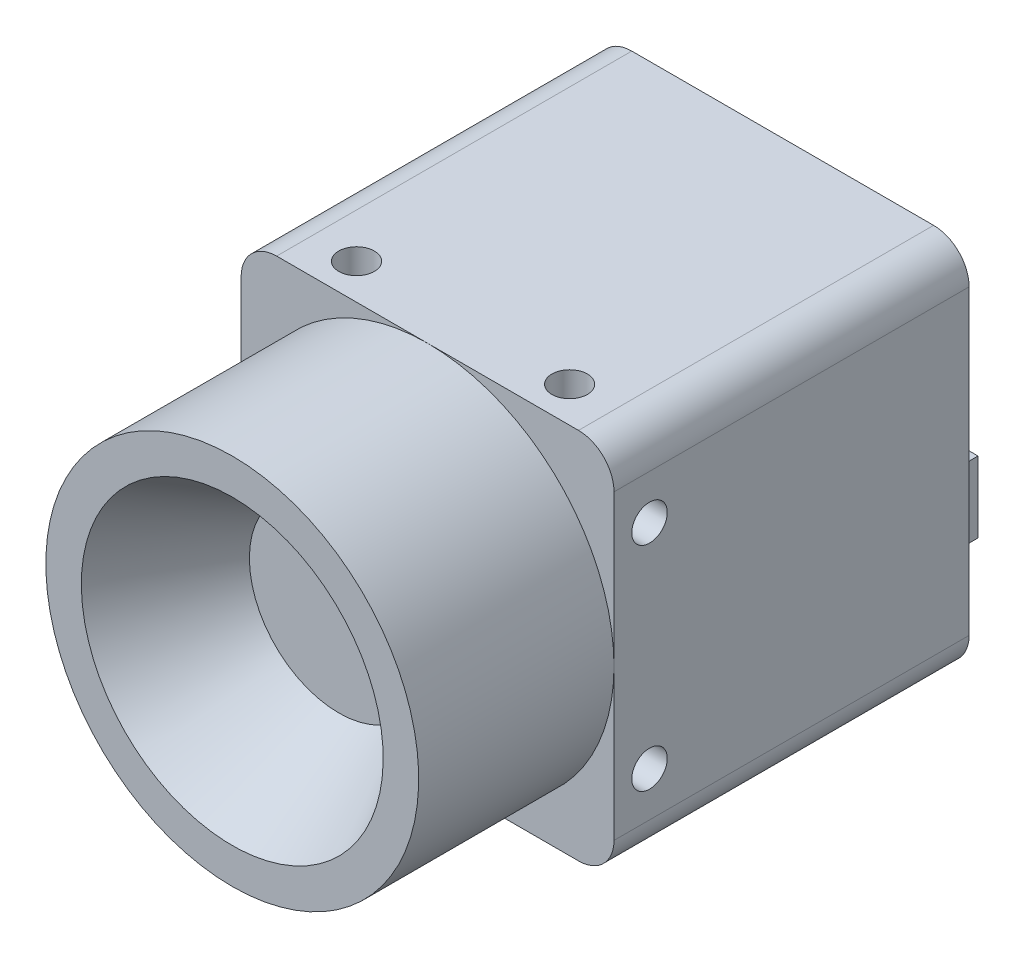
ISO-10303-21;
HEADER;
FILE_DESCRIPTION(('STEP AP214'),'2;1');
FILE_NAME('part.step','',(''),(''),'','','');
FILE_SCHEMA(('AUTOMOTIVE_DESIGN { 1 0 10303 214 1 1 1 1 }'));
ENDSEC;
DATA;
#1=APPLICATION_CONTEXT('core data for automotive mechanical design processes');
#2=APPLICATION_PROTOCOL_DEFINITION('international standard','automotive_design',2000,#1);
#3=PRODUCT_CONTEXT('',#1,'mechanical');
#4=PRODUCT('Part','Part','',(#3));
#5=PRODUCT_RELATED_PRODUCT_CATEGORY('part','',(#4));
#6=PRODUCT_DEFINITION_FORMATION('','',#4);
#7=PRODUCT_DEFINITION_CONTEXT('part definition',#1,'design');
#8=PRODUCT_DEFINITION('design','',#6,#7);
#9=PRODUCT_DEFINITION_SHAPE('','',#8);
#10=(LENGTH_UNIT() NAMED_UNIT(*) SI_UNIT(.MILLI.,.METRE.));
#11=(NAMED_UNIT(*) PLANE_ANGLE_UNIT() SI_UNIT($,.RADIAN.));
#12=(NAMED_UNIT(*) SI_UNIT($,.STERADIAN.) SOLID_ANGLE_UNIT());
#13=UNCERTAINTY_MEASURE_WITH_UNIT(LENGTH_MEASURE(1.E-05),#10,'distance_accuracy_value','');
#14=(GEOMETRIC_REPRESENTATION_CONTEXT(3) GLOBAL_UNCERTAINTY_ASSIGNED_CONTEXT((#13)) GLOBAL_UNIT_ASSIGNED_CONTEXT((#10,
#11,#12)) REPRESENTATION_CONTEXT('',''));
#15=CARTESIAN_POINT('',(0.,0.,0.));
#16=DIRECTION('',(0.,0.,1.));
#17=DIRECTION('',(1.,0.,0.));
#18=AXIS2_PLACEMENT_3D('',#15,#16,#17);
#19=CARTESIAN_POINT('',(-8.5,-8.5,0.));
#20=DIRECTION('',(0.,0.,-1.));
#21=DIRECTION('',(-1.,0.,0.));
#22=AXIS2_PLACEMENT_3D('',#19,#20,#21);
#23=PLANE('',#22);
#24=CARTESIAN_POINT('',(-8.5,-8.5,0.));
#25=DIRECTION('',(0.,0.,1.));
#26=DIRECTION('',(-1.,0.,0.));
#27=AXIS2_PLACEMENT_3D('',#24,#25,#26);
#28=CIRCLE('',#27,2.);
#29=CARTESIAN_POINT('',(-10.5,-8.49999999999999,0.));
#30=VERTEX_POINT('',#29);
#31=CARTESIAN_POINT('',(-8.49999999999999,-10.5,0.));
#32=VERTEX_POINT('',#31);
#33=EDGE_CURVE('E188',#30,#32,#28,.T.);
#34=ORIENTED_EDGE('',*,*,#33,.F.);
#35=DIRECTION('',(0.,-1.,0.));
#36=VECTOR('',#35,1.);
#37=CARTESIAN_POINT('',(-10.5,-8.49999999999999,0.));
#38=LINE('',#37,#36);
#39=CARTESIAN_POINT('',(-10.5,8.49999999999999,0.));
#40=VERTEX_POINT('',#39);
#41=EDGE_CURVE('E195',#40,#30,#38,.T.);
#42=ORIENTED_EDGE('',*,*,#41,.F.);
#43=CARTESIAN_POINT('',(-8.5,8.5,0.));
#44=DIRECTION('',(0.,0.,1.));
#45=DIRECTION('',(-1.,0.,0.));
#46=AXIS2_PLACEMENT_3D('',#43,#44,#45);
#47=CIRCLE('',#46,2.);
#48=CARTESIAN_POINT('',(-8.49999999999999,10.5,0.));
#49=VERTEX_POINT('',#48);
#50=EDGE_CURVE('E243',#49,#40,#47,.T.);
#51=ORIENTED_EDGE('',*,*,#50,.F.);
#52=DIRECTION('',(-1.,0.,0.));
#53=VECTOR('',#52,1.);
#54=CARTESIAN_POINT('',(-8.49999999999999,10.5,0.));
#55=LINE('',#54,#53);
#56=CARTESIAN_POINT('',(8.49999999999999,10.5,0.));
#57=VERTEX_POINT('',#56);
#58=EDGE_CURVE('E240',#57,#49,#55,.T.);
#59=ORIENTED_EDGE('',*,*,#58,.F.);
#60=CARTESIAN_POINT('',(8.5,8.5,0.));
#61=DIRECTION('',(0.,0.,1.));
#62=DIRECTION('',(-1.,0.,0.));
#63=AXIS2_PLACEMENT_3D('',#60,#61,#62);
#64=CIRCLE('',#63,2.);
#65=CARTESIAN_POINT('',(10.5,8.49999999999999,0.));
#66=VERTEX_POINT('',#65);
#67=EDGE_CURVE('E237',#66,#57,#64,.T.);
#68=ORIENTED_EDGE('',*,*,#67,.F.);
#69=DIRECTION('',(0.,1.,0.));
#70=VECTOR('',#69,1.);
#71=CARTESIAN_POINT('',(10.5,-8.49999999999999,0.));
#72=LINE('',#71,#70);
#73=CARTESIAN_POINT('',(10.5,-8.5,0.));
#74=VERTEX_POINT('',#73);
#75=EDGE_CURVE('E234',#74,#66,#72,.T.);
#76=ORIENTED_EDGE('',*,*,#75,.F.);
#77=CARTESIAN_POINT('',(8.5,-8.5,0.));
#78=DIRECTION('',(0.,0.,1.));
#79=DIRECTION('',(1.,0.,0.));
#80=AXIS2_PLACEMENT_3D('',#77,#78,#79);
#81=CIRCLE('',#80,2.);
#82=CARTESIAN_POINT('',(8.49999999999999,-10.5,0.));
#83=VERTEX_POINT('',#82);
#84=EDGE_CURVE('E231',#83,#74,#81,.T.);
#85=ORIENTED_EDGE('',*,*,#84,.F.);
#86=DIRECTION('',(1.,0.,0.));
#87=VECTOR('',#86,1.);
#88=CARTESIAN_POINT('',(-8.49999999999999,-10.5,0.));
#89=LINE('',#88,#87);
#90=EDGE_CURVE('E228',#32,#83,#89,.T.);
#91=ORIENTED_EDGE('',*,*,#90,.F.);
#92=EDGE_LOOP('',(#34,#42,#51,#59,#68,#76,#85,#91));
#93=FACE_BOUND('',#92,.T.);
#94=DIRECTION('',(-1.,0.,0.));
#95=VECTOR('',#94,1.);
#96=CARTESIAN_POINT('',(5.,-9.5,0.));
#97=LINE('',#96,#95);
#98=CARTESIAN_POINT('',(5.,-9.5,0.));
#99=VERTEX_POINT('',#98);
#100=CARTESIAN_POINT('',(-5.,-9.5,0.));
#101=VERTEX_POINT('',#100);
#102=EDGE_CURVE('E532',#99,#101,#97,.T.);
#103=ORIENTED_EDGE('',*,*,#102,.F.);
#104=DIRECTION('',(0.,-1.,0.));
#105=VECTOR('',#104,1.);
#106=CARTESIAN_POINT('',(5.,-5.5,0.));
#107=LINE('',#106,#105);
#108=CARTESIAN_POINT('',(5.,-5.5,0.));
#109=VERTEX_POINT('',#108);
#110=EDGE_CURVE('E167',#109,#99,#107,.T.);
#111=ORIENTED_EDGE('',*,*,#110,.F.);
#112=DIRECTION('',(1.,0.,0.));
#113=VECTOR('',#112,1.);
#114=CARTESIAN_POINT('',(5.,-5.5,0.));
#115=LINE('',#114,#113);
#116=CARTESIAN_POINT('',(-5.,-5.5,0.));
#117=VERTEX_POINT('',#116);
#118=EDGE_CURVE('E163',#117,#109,#115,.T.);
#119=ORIENTED_EDGE('',*,*,#118,.F.);
#120=DIRECTION('',(0.,1.,0.));
#121=VECTOR('',#120,1.);
#122=CARTESIAN_POINT('',(-5.,-5.5,0.));
#123=LINE('',#122,#121);
#124=EDGE_CURVE('E535',#101,#117,#123,.T.);
#125=ORIENTED_EDGE('',*,*,#124,.F.);
#126=EDGE_LOOP('',(#103,#111,#119,#125));
#127=FACE_BOUND('',#126,.T.);
#128=ADVANCED_FACE('F38',(#93,#127),#23,.T.);
#129=CARTESIAN_POINT('',(-8.5,-8.5,20.));
#130=DIRECTION('',(0.,0.,-1.));
#131=DIRECTION('',(-1.,0.,0.));
#132=AXIS2_PLACEMENT_3D('',#129,#130,#131);
#133=PLANE('',#132);
#134=DIRECTION('',(-1.,0.,0.));
#135=VECTOR('',#134,1.);
#136=CARTESIAN_POINT('',(-8.49999999999999,10.5,20.));
#137=LINE('',#136,#135);
#138=CARTESIAN_POINT('',(8.49999999999999,10.5,20.));
#139=VERTEX_POINT('',#138);
#140=CARTESIAN_POINT('',(0.,10.5,20.));
#141=VERTEX_POINT('',#140);
#142=EDGE_CURVE('E212',#139,#141,#137,.T.);
#143=ORIENTED_EDGE('',*,*,#142,.T.);
#144=CARTESIAN_POINT('',(0.,0.,20.));
#145=DIRECTION('',(0.,0.,-1.));
#146=DIRECTION('',(0.,1.,0.));
#147=AXIS2_PLACEMENT_3D('',#144,#145,#146);
#148=CIRCLE('',#147,10.5);
#149=CARTESIAN_POINT('',(10.5,0.,20.));
#150=VERTEX_POINT('',#149);
#151=EDGE_CURVE('E50',#141,#150,#148,.T.);
#152=ORIENTED_EDGE('',*,*,#151,.T.);
#153=DIRECTION('',(0.,1.,0.));
#154=VECTOR('',#153,1.);
#155=CARTESIAN_POINT('',(10.5,-8.49999999999999,20.));
#156=LINE('',#155,#154);
#157=CARTESIAN_POINT('',(10.5,8.49999999999999,20.));
#158=VERTEX_POINT('',#157);
#159=EDGE_CURVE('E203',#150,#158,#156,.T.);
#160=ORIENTED_EDGE('',*,*,#159,.T.);
#161=CARTESIAN_POINT('',(8.5,8.5,20.));
#162=DIRECTION('',(0.,0.,1.));
#163=DIRECTION('',(-1.,0.,0.));
#164=AXIS2_PLACEMENT_3D('',#161,#162,#163);
#165=CIRCLE('',#164,2.);
#166=EDGE_CURVE('E208',#158,#139,#165,.T.);
#167=ORIENTED_EDGE('',*,*,#166,.T.);
#168=EDGE_LOOP('',(#143,#152,#160,#167));
#169=FACE_BOUND('',#168,.T.);
#170=ADVANCED_FACE('F319',(#169),#133,.F.);
#171=CARTESIAN_POINT('',(10.5,-8.5,20.));
#172=VERTEX_POINT('',#171);
#173=EDGE_CURVE('E204',#172,#150,#156,.T.);
#174=ORIENTED_EDGE('',*,*,#173,.T.);
#175=CARTESIAN_POINT('',(0.,-10.5,20.));
#176=VERTEX_POINT('',#175);
#177=EDGE_CURVE('E11',#150,#176,#148,.T.);
#178=ORIENTED_EDGE('',*,*,#177,.T.);
#179=DIRECTION('',(1.,0.,0.));
#180=VECTOR('',#179,1.);
#181=CARTESIAN_POINT('',(-8.49999999999999,-10.5,20.));
#182=LINE('',#181,#180);
#183=CARTESIAN_POINT('',(8.49999999999999,-10.5,20.));
#184=VERTEX_POINT('',#183);
#185=EDGE_CURVE('E194',#176,#184,#182,.T.);
#186=ORIENTED_EDGE('',*,*,#185,.T.);
#187=CARTESIAN_POINT('',(8.5,-8.5,20.));
#188=DIRECTION('',(0.,0.,1.));
#189=DIRECTION('',(1.,0.,0.));
#190=AXIS2_PLACEMENT_3D('',#187,#188,#189);
#191=CIRCLE('',#190,2.);
#192=EDGE_CURVE('E200',#184,#172,#191,.T.);
#193=ORIENTED_EDGE('',*,*,#192,.T.);
#194=EDGE_LOOP('',(#174,#178,#186,#193));
#195=FACE_BOUND('',#194,.T.);
#196=ADVANCED_FACE('F316',(#195),#133,.F.);
#197=CARTESIAN_POINT('',(-8.49999999999999,-10.5,20.));
#198=VERTEX_POINT('',#197);
#199=EDGE_CURVE('E196',#198,#176,#182,.T.);
#200=ORIENTED_EDGE('',*,*,#199,.T.);
#201=CARTESIAN_POINT('',(-10.5,0.,20.));
#202=VERTEX_POINT('',#201);
#203=EDGE_CURVE('E48',#176,#202,#148,.T.);
#204=ORIENTED_EDGE('',*,*,#203,.T.);
#205=DIRECTION('',(0.,-1.,0.));
#206=VECTOR('',#205,1.);
#207=CARTESIAN_POINT('',(-10.5,-8.49999999999999,20.));
#208=LINE('',#207,#206);
#209=CARTESIAN_POINT('',(-10.5,-8.49999999999999,20.));
#210=VERTEX_POINT('',#209);
#211=EDGE_CURVE('E219',#202,#210,#208,.T.);
#212=ORIENTED_EDGE('',*,*,#211,.T.);
#213=CARTESIAN_POINT('',(-8.5,-8.5,20.));
#214=DIRECTION('',(0.,0.,1.));
#215=DIRECTION('',(-1.,0.,0.));
#216=AXIS2_PLACEMENT_3D('',#213,#214,#215);
#217=CIRCLE('',#216,2.);
#218=EDGE_CURVE('E190',#210,#198,#217,.T.);
#219=ORIENTED_EDGE('',*,*,#218,.T.);
#220=EDGE_LOOP('',(#200,#204,#212,#219));
#221=FACE_BOUND('',#220,.T.);
#222=ADVANCED_FACE('F288',(#221),#133,.F.);
#223=CARTESIAN_POINT('',(-8.5,-8.5,20.));
#224=DIRECTION('',(0.,0.,-1.));
#225=DIRECTION('',(-1.,0.,0.));
#226=AXIS2_PLACEMENT_3D('',#223,#224,#225);
#227=CYLINDRICAL_SURFACE('',#226,2.);
#228=ORIENTED_EDGE('',*,*,#33,.T.);
#229=DIRECTION('',(0.,0.,-1.));
#230=VECTOR('',#229,1.);
#231=CARTESIAN_POINT('',(-8.49999999999999,-10.5,20.));
#232=LINE('',#231,#230);
#233=EDGE_CURVE('E42',#198,#32,#232,.T.);
#234=ORIENTED_EDGE('',*,*,#233,.F.);
#235=ORIENTED_EDGE('',*,*,#218,.F.);
#236=DIRECTION('',(0.,0.,-1.));
#237=VECTOR('',#236,1.);
#238=CARTESIAN_POINT('',(-10.5,-8.49999999999999,20.));
#239=LINE('',#238,#237);
#240=EDGE_CURVE('E224',#210,#30,#239,.T.);
#241=ORIENTED_EDGE('',*,*,#240,.T.);
#242=EDGE_LOOP('',(#228,#234,#235,#241));
#243=FACE_BOUND('',#242,.T.);
#244=ADVANCED_FACE('F40',(#243),#227,.T.);
#245=CARTESIAN_POINT('',(-8.49999999999999,-10.5,20.));
#246=DIRECTION('',(0.,1.,0.));
#247=DIRECTION('',(0.,0.,1.));
#248=AXIS2_PLACEMENT_3D('',#245,#246,#247);
#249=PLANE('',#248);
#250=CARTESIAN_POINT('',(-6.00000000000009,-10.4999999999999,18.));
#251=DIRECTION('',(0.,-1.,0.));
#252=DIRECTION('',(0.,0.,1.));
#253=AXIS2_PLACEMENT_3D('',#250,#251,#252);
#254=CIRCLE('',#253,1.);
#255=CARTESIAN_POINT('',(-6.00000000000009,-10.4999999999999,19.));
#256=VERTEX_POINT('',#255);
#257=EDGE_CURVE('E463',#256,#256,#254,.T.);
#258=ORIENTED_EDGE('',*,*,#257,.F.);
#259=EDGE_LOOP('',(#258));
#260=FACE_BOUND('',#259,.T.);
#261=CARTESIAN_POINT('',(5.99999999999991,-10.5,18.));
#262=DIRECTION('',(0.,-1.,0.));
#263=DIRECTION('',(0.,0.,1.));
#264=AXIS2_PLACEMENT_3D('',#261,#262,#263);
#265=CIRCLE('',#264,1.);
#266=CARTESIAN_POINT('',(5.99999999999991,-10.5,19.));
#267=VERTEX_POINT('',#266);
#268=EDGE_CURVE('E464',#267,#267,#265,.T.);
#269=ORIENTED_EDGE('',*,*,#268,.F.);
#270=EDGE_LOOP('',(#269));
#271=FACE_BOUND('',#270,.T.);
#272=ORIENTED_EDGE('',*,*,#90,.T.);
#273=DIRECTION('',(0.,0.,-1.));
#274=VECTOR('',#273,1.);
#275=CARTESIAN_POINT('',(8.49999999999999,-10.5,20.));
#276=LINE('',#275,#274);
#277=EDGE_CURVE('E270',#184,#83,#276,.T.);
#278=ORIENTED_EDGE('',*,*,#277,.F.);
#279=ORIENTED_EDGE('',*,*,#185,.F.);
#280=ORIENTED_EDGE('',*,*,#199,.F.);
#281=ORIENTED_EDGE('',*,*,#233,.T.);
#282=EDGE_LOOP('',(#272,#278,#279,#280,#281));
#283=FACE_BOUND('',#282,.T.);
#284=ADVANCED_FACE('F309',(#260,#271,#283),#249,.F.);
#285=CARTESIAN_POINT('',(8.5,-8.5,20.));
#286=DIRECTION('',(0.,0.,-1.));
#287=DIRECTION('',(-1.,0.,0.));
#288=AXIS2_PLACEMENT_3D('',#285,#286,#287);
#289=CYLINDRICAL_SURFACE('',#288,2.);
#290=ORIENTED_EDGE('',*,*,#84,.T.);
#291=DIRECTION('',(0.,0.,-1.));
#292=VECTOR('',#291,1.);
#293=CARTESIAN_POINT('',(10.5,-8.5,20.));
#294=LINE('',#293,#292);
#295=EDGE_CURVE('E267',#172,#74,#294,.T.);
#296=ORIENTED_EDGE('',*,*,#295,.F.);
#297=ORIENTED_EDGE('',*,*,#192,.F.);
#298=ORIENTED_EDGE('',*,*,#277,.T.);
#299=EDGE_LOOP('',(#290,#296,#297,#298));
#300=FACE_BOUND('',#299,.T.);
#301=ADVANCED_FACE('F314',(#300),#289,.T.);
#302=CARTESIAN_POINT('',(10.5,-8.49999999999999,20.));
#303=DIRECTION('',(-1.,0.,0.));
#304=DIRECTION('',(0.,0.,1.));
#305=AXIS2_PLACEMENT_3D('',#302,#303,#304);
#306=PLANE('',#305);
#307=CARTESIAN_POINT('',(10.5,6.00000000000005,18.));
#308=DIRECTION('',(1.,0.,0.));
#309=DIRECTION('',(0.,0.,1.));
#310=AXIS2_PLACEMENT_3D('',#307,#308,#309);
#311=CIRCLE('',#310,1.);
#312=CARTESIAN_POINT('',(10.5,6.00000000000005,19.));
#313=VERTEX_POINT('',#312);
#314=EDGE_CURVE('E479',#313,#313,#311,.T.);
#315=ORIENTED_EDGE('',*,*,#314,.F.);
#316=EDGE_LOOP('',(#315));
#317=FACE_BOUND('',#316,.T.);
#318=CARTESIAN_POINT('',(10.5,-5.99999999999995,18.));
#319=DIRECTION('',(1.,0.,0.));
#320=DIRECTION('',(0.,0.,1.));
#321=AXIS2_PLACEMENT_3D('',#318,#319,#320);
#322=CIRCLE('',#321,1.);
#323=CARTESIAN_POINT('',(10.5,-5.99999999999995,19.));
#324=VERTEX_POINT('',#323);
#325=EDGE_CURVE('E478',#324,#324,#322,.T.);
#326=ORIENTED_EDGE('',*,*,#325,.F.);
#327=EDGE_LOOP('',(#326));
#328=FACE_BOUND('',#327,.T.);
#329=ORIENTED_EDGE('',*,*,#75,.T.);
#330=DIRECTION('',(0.,0.,-1.));
#331=VECTOR('',#330,1.);
#332=CARTESIAN_POINT('',(10.5,8.49999999999999,20.));
#333=LINE('',#332,#331);
#334=EDGE_CURVE('E263',#158,#66,#333,.T.);
#335=ORIENTED_EDGE('',*,*,#334,.F.);
#336=ORIENTED_EDGE('',*,*,#159,.F.);
#337=ORIENTED_EDGE('',*,*,#173,.F.);
#338=ORIENTED_EDGE('',*,*,#295,.T.);
#339=EDGE_LOOP('',(#329,#335,#336,#337,#338));
#340=FACE_BOUND('',#339,.T.);
#341=ADVANCED_FACE('F339',(#317,#328,#340),#306,.F.);
#342=CARTESIAN_POINT('',(8.5,8.5,20.));
#343=DIRECTION('',(0.,0.,-1.));
#344=DIRECTION('',(-1.,0.,0.));
#345=AXIS2_PLACEMENT_3D('',#342,#343,#344);
#346=CYLINDRICAL_SURFACE('',#345,2.);
#347=ORIENTED_EDGE('',*,*,#67,.T.);
#348=DIRECTION('',(0.,0.,-1.));
#349=VECTOR('',#348,1.);
#350=CARTESIAN_POINT('',(8.49999999999999,10.5,20.));
#351=LINE('',#350,#349);
#352=EDGE_CURVE('E259',#139,#57,#351,.T.);
#353=ORIENTED_EDGE('',*,*,#352,.F.);
#354=ORIENTED_EDGE('',*,*,#166,.F.);
#355=ORIENTED_EDGE('',*,*,#334,.T.);
#356=EDGE_LOOP('',(#347,#353,#354,#355));
#357=FACE_BOUND('',#356,.T.);
#358=ADVANCED_FACE('F335',(#357),#346,.T.);
#359=CARTESIAN_POINT('',(-8.49999999999999,10.5,20.));
#360=DIRECTION('',(0.,-1.,0.));
#361=DIRECTION('',(0.,0.,-1.));
#362=AXIS2_PLACEMENT_3D('',#359,#360,#361);
#363=PLANE('',#362);
#364=CARTESIAN_POINT('',(-5.99999999999999,10.5,18.));
#365=DIRECTION('',(0.,1.,0.));
#366=DIRECTION('',(0.,0.,1.));
#367=AXIS2_PLACEMENT_3D('',#364,#365,#366);
#368=CIRCLE('',#367,1.);
#369=CARTESIAN_POINT('',(-5.99999999999999,10.5,19.));
#370=VERTEX_POINT('',#369);
#371=EDGE_CURVE('E491',#370,#370,#368,.T.);
#372=ORIENTED_EDGE('',*,*,#371,.F.);
#373=EDGE_LOOP('',(#372));
#374=FACE_BOUND('',#373,.T.);
#375=CARTESIAN_POINT('',(6.00000000000001,10.5,18.));
#376=DIRECTION('',(0.,1.,0.));
#377=DIRECTION('',(0.,0.,1.));
#378=AXIS2_PLACEMENT_3D('',#375,#376,#377);
#379=CIRCLE('',#378,1.);
#380=CARTESIAN_POINT('',(6.00000000000001,10.5,19.));
#381=VERTEX_POINT('',#380);
#382=EDGE_CURVE('E490',#381,#381,#379,.T.);
#383=ORIENTED_EDGE('',*,*,#382,.F.);
#384=EDGE_LOOP('',(#383));
#385=FACE_BOUND('',#384,.T.);
#386=ORIENTED_EDGE('',*,*,#58,.T.);
#387=DIRECTION('',(0.,0.,-1.));
#388=VECTOR('',#387,1.);
#389=CARTESIAN_POINT('',(-8.49999999999999,10.5,20.));
#390=LINE('',#389,#388);
#391=CARTESIAN_POINT('',(-8.49999999999999,10.5,20.));
#392=VERTEX_POINT('',#391);
#393=EDGE_CURVE('E255',#392,#49,#390,.T.);
#394=ORIENTED_EDGE('',*,*,#393,.F.);
#395=EDGE_CURVE('E211',#141,#392,#137,.T.);
#396=ORIENTED_EDGE('',*,*,#395,.F.);
#397=ORIENTED_EDGE('',*,*,#142,.F.);
#398=ORIENTED_EDGE('',*,*,#352,.T.);
#399=EDGE_LOOP('',(#386,#394,#396,#397,#398));
#400=FACE_BOUND('',#399,.T.);
#401=ADVANCED_FACE('F332',(#374,#385,#400),#363,.F.);
#402=CARTESIAN_POINT('',(-8.5,8.5,20.));
#403=DIRECTION('',(0.,0.,-1.));
#404=DIRECTION('',(-1.,0.,0.));
#405=AXIS2_PLACEMENT_3D('',#402,#403,#404);
#406=CYLINDRICAL_SURFACE('',#405,2.);
#407=ORIENTED_EDGE('',*,*,#50,.T.);
#408=DIRECTION('',(0.,0.,-1.));
#409=VECTOR('',#408,1.);
#410=CARTESIAN_POINT('',(-10.5,8.49999999999999,20.));
#411=LINE('',#410,#409);
#412=CARTESIAN_POINT('',(-10.5,8.49999999999999,20.));
#413=VERTEX_POINT('',#412);
#414=EDGE_CURVE('E251',#413,#40,#411,.T.);
#415=ORIENTED_EDGE('',*,*,#414,.F.);
#416=CARTESIAN_POINT('',(-8.5,8.5,20.));
#417=DIRECTION('',(0.,0.,1.));
#418=DIRECTION('',(-1.,0.,0.));
#419=AXIS2_PLACEMENT_3D('',#416,#417,#418);
#420=CIRCLE('',#419,2.);
#421=EDGE_CURVE('E216',#392,#413,#420,.T.);
#422=ORIENTED_EDGE('',*,*,#421,.F.);
#423=ORIENTED_EDGE('',*,*,#393,.T.);
#424=EDGE_LOOP('',(#407,#415,#422,#423));
#425=FACE_BOUND('',#424,.T.);
#426=ADVANCED_FACE('F300',(#425),#406,.T.);
#427=CARTESIAN_POINT('',(-10.5,-8.49999999999999,20.));
#428=DIRECTION('',(1.,0.,0.));
#429=DIRECTION('',(0.,0.,-1.));
#430=AXIS2_PLACEMENT_3D('',#427,#428,#429);
#431=PLANE('',#430);
#432=CARTESIAN_POINT('',(-10.5,6.,18.));
#433=DIRECTION('',(-1.,0.,0.));
#434=DIRECTION('',(0.,0.,1.));
#435=AXIS2_PLACEMENT_3D('',#432,#433,#434);
#436=CIRCLE('',#435,1.);
#437=CARTESIAN_POINT('',(-10.5,6.,19.));
#438=VERTEX_POINT('',#437);
#439=EDGE_CURVE('E514',#438,#438,#436,.T.);
#440=ORIENTED_EDGE('',*,*,#439,.F.);
#441=EDGE_LOOP('',(#440));
#442=FACE_BOUND('',#441,.T.);
#443=CARTESIAN_POINT('',(-10.5,-6.,18.));
#444=DIRECTION('',(-1.,0.,0.));
#445=DIRECTION('',(0.,0.,1.));
#446=AXIS2_PLACEMENT_3D('',#443,#444,#445);
#447=CIRCLE('',#446,1.);
#448=CARTESIAN_POINT('',(-10.5,-6.,19.));
#449=VERTEX_POINT('',#448);
#450=EDGE_CURVE('E506',#449,#449,#447,.T.);
#451=ORIENTED_EDGE('',*,*,#450,.F.);
#452=EDGE_LOOP('',(#451));
#453=FACE_BOUND('',#452,.T.);
#454=ORIENTED_EDGE('',*,*,#41,.T.);
#455=ORIENTED_EDGE('',*,*,#240,.F.);
#456=ORIENTED_EDGE('',*,*,#211,.F.);
#457=EDGE_CURVE('E220',#413,#202,#208,.T.);
#458=ORIENTED_EDGE('',*,*,#457,.F.);
#459=ORIENTED_EDGE('',*,*,#414,.T.);
#460=EDGE_LOOP('',(#454,#455,#456,#458,#459));
#461=FACE_BOUND('',#460,.T.);
#462=ADVANCED_FACE('F292',(#442,#453,#461),#431,.F.);
#463=ORIENTED_EDGE('',*,*,#457,.T.);
#464=EDGE_CURVE('E189',#202,#141,#148,.T.);
#465=ORIENTED_EDGE('',*,*,#464,.T.);
#466=ORIENTED_EDGE('',*,*,#395,.T.);
#467=ORIENTED_EDGE('',*,*,#421,.T.);
#468=EDGE_LOOP('',(#463,#465,#466,#467));
#469=FACE_BOUND('',#468,.T.);
#470=ADVANCED_FACE('F295',(#469),#133,.F.);
#471=CARTESIAN_POINT('',(0.,0.,20.));
#472=DIRECTION('',(0.,0.,-1.));
#473=DIRECTION('',(0.,1.,0.));
#474=AXIS2_PLACEMENT_3D('',#471,#472,#473);
#475=CYLINDRICAL_SURFACE('',#474,10.5);
#476=CARTESIAN_POINT('',(0.,0.,31.));
#477=DIRECTION('',(0.,0.,-1.));
#478=DIRECTION('',(0.,1.,0.));
#479=AXIS2_PLACEMENT_3D('',#476,#477,#478);
#480=CIRCLE('',#479,10.5);
#481=CARTESIAN_POINT('',(0.,10.5,31.));
#482=VERTEX_POINT('',#481);
#483=EDGE_CURVE('E170',#482,#482,#480,.T.);
#484=ORIENTED_EDGE('',*,*,#483,.T.);
#485=EDGE_LOOP('',(#484));
#486=FACE_BOUND('',#485,.T.);
#487=ORIENTED_EDGE('',*,*,#151,.F.);
#488=ORIENTED_EDGE('',*,*,#464,.F.);
#489=ORIENTED_EDGE('',*,*,#203,.F.);
#490=ORIENTED_EDGE('',*,*,#177,.F.);
#491=EDGE_LOOP('',(#487,#488,#489,#490));
#492=FACE_BOUND('',#491,.T.);
#493=ADVANCED_FACE('F362',(#486,#492),#475,.T.);
#494=CARTESIAN_POINT('',(0.,0.,25.));
#495=DIRECTION('',(0.,0.,1.));
#496=DIRECTION('',(0.,-1.,0.));
#497=AXIS2_PLACEMENT_3D('',#494,#495,#496);
#498=PLANE('',#497);
#499=CARTESIAN_POINT('',(0.,0.,25.));
#500=DIRECTION('',(0.,0.,-1.));
#501=DIRECTION('',(0.,1.,0.));
#502=AXIS2_PLACEMENT_3D('',#499,#500,#501);
#503=CIRCLE('',#502,5.03589838486227);
#504=CARTESIAN_POINT('',(0.,5.03589838486227,25.));
#505=VERTEX_POINT('',#504);
#506=EDGE_CURVE('E183',#505,#505,#503,.T.);
#507=ORIENTED_EDGE('',*,*,#506,.F.);
#508=EDGE_LOOP('',(#507));
#509=FACE_BOUND('',#508,.T.);
#510=ADVANCED_FACE('F364',(#509),#498,.T.);
#511=CARTESIAN_POINT('',(0.,0.,31.));
#512=DIRECTION('',(0.,0.,1.));
#513=DIRECTION('',(0.,-1.,0.));
#514=AXIS2_PLACEMENT_3D('',#511,#512,#513);
#515=CONICAL_SURFACE('',#514,8.49999999999999,0.523598775598295);
#516=ORIENTED_EDGE('',*,*,#506,.T.);
#517=EDGE_LOOP('',(#516));
#518=FACE_BOUND('',#517,.T.);
#519=CARTESIAN_POINT('',(0.,0.,31.));
#520=DIRECTION('',(0.,0.,-1.));
#521=DIRECTION('',(0.,1.,0.));
#522=AXIS2_PLACEMENT_3D('',#519,#520,#521);
#523=CIRCLE('',#522,8.49999999999999);
#524=CARTESIAN_POINT('',(0.,8.5,31.));
#525=VERTEX_POINT('',#524);
#526=EDGE_CURVE('E175',#525,#525,#523,.T.);
#527=ORIENTED_EDGE('',*,*,#526,.F.);
#528=EDGE_LOOP('',(#527));
#529=FACE_BOUND('',#528,.T.);
#530=ADVANCED_FACE('F370',(#518,#529),#515,.F.);
#531=CARTESIAN_POINT('',(0.,8.5,31.));
#532=DIRECTION('',(0.,0.,1.));
#533=DIRECTION('',(0.,-1.,0.));
#534=AXIS2_PLACEMENT_3D('',#531,#532,#533);
#535=PLANE('',#534);
#536=ORIENTED_EDGE('',*,*,#526,.T.);
#537=EDGE_LOOP('',(#536));
#538=FACE_BOUND('',#537,.T.);
#539=ORIENTED_EDGE('',*,*,#483,.F.);
#540=EDGE_LOOP('',(#539));
#541=FACE_BOUND('',#540,.T.);
#542=ADVANCED_FACE('F376',(#538,#541),#535,.T.);
#543=CARTESIAN_POINT('',(5.,-5.5,-6.));
#544=DIRECTION('',(-1.,0.,0.));
#545=DIRECTION('',(0.,-1.,0.));
#546=AXIS2_PLACEMENT_3D('',#543,#544,#545);
#547=PLANE('',#546);
#548=ORIENTED_EDGE('',*,*,#110,.T.);
#549=DIRECTION('',(0.,0.,1.));
#550=VECTOR('',#549,1.);
#551=CARTESIAN_POINT('',(5.,-9.5,-6.));
#552=LINE('',#551,#550);
#553=CARTESIAN_POINT('',(5.,-9.5,-6.));
#554=VERTEX_POINT('',#553);
#555=EDGE_CURVE('E146',#554,#99,#552,.T.);
#556=ORIENTED_EDGE('',*,*,#555,.F.);
#557=DIRECTION('',(0.,-1.,0.));
#558=VECTOR('',#557,1.);
#559=CARTESIAN_POINT('',(5.,-5.5,-6.));
#560=LINE('',#559,#558);
#561=CARTESIAN_POINT('',(5.,-5.5,-6.));
#562=VERTEX_POINT('',#561);
#563=EDGE_CURVE('E154',#562,#554,#560,.T.);
#564=ORIENTED_EDGE('',*,*,#563,.F.);
#565=DIRECTION('',(0.,0.,1.));
#566=VECTOR('',#565,1.);
#567=CARTESIAN_POINT('',(5.,-5.5,-6.));
#568=LINE('',#567,#566);
#569=EDGE_CURVE('E529',#562,#109,#568,.T.);
#570=ORIENTED_EDGE('',*,*,#569,.T.);
#571=EDGE_LOOP('',(#548,#556,#564,#570));
#572=FACE_BOUND('',#571,.T.);
#573=ADVANCED_FACE('F165',(#572),#547,.F.);
#574=CARTESIAN_POINT('',(5.,-9.5,-6.));
#575=DIRECTION('',(0.,1.,0.));
#576=DIRECTION('',(0.,0.,1.));
#577=AXIS2_PLACEMENT_3D('',#574,#575,#576);
#578=PLANE('',#577);
#579=ORIENTED_EDGE('',*,*,#102,.T.);
#580=DIRECTION('',(0.,0.,1.));
#581=VECTOR('',#580,1.);
#582=CARTESIAN_POINT('',(-5.,-9.5,-6.));
#583=LINE('',#582,#581);
#584=CARTESIAN_POINT('',(-5.,-9.5,-6.));
#585=VERTEX_POINT('',#584);
#586=EDGE_CURVE('E149',#585,#101,#583,.T.);
#587=ORIENTED_EDGE('',*,*,#586,.F.);
#588=DIRECTION('',(-1.,0.,0.));
#589=VECTOR('',#588,1.);
#590=CARTESIAN_POINT('',(5.,-9.5,-6.));
#591=LINE('',#590,#589);
#592=EDGE_CURVE('E142',#554,#585,#591,.T.);
#593=ORIENTED_EDGE('',*,*,#592,.F.);
#594=ORIENTED_EDGE('',*,*,#555,.T.);
#595=EDGE_LOOP('',(#579,#587,#593,#594));
#596=FACE_BOUND('',#595,.T.);
#597=ADVANCED_FACE('F144',(#596),#578,.F.);
#598=CARTESIAN_POINT('',(-5.,-5.5,-6.));
#599=DIRECTION('',(1.,0.,0.));
#600=DIRECTION('',(0.,1.,0.));
#601=AXIS2_PLACEMENT_3D('',#598,#599,#600);
#602=PLANE('',#601);
#603=ORIENTED_EDGE('',*,*,#124,.T.);
#604=DIRECTION('',(0.,0.,1.));
#605=VECTOR('',#604,1.);
#606=CARTESIAN_POINT('',(-5.,-5.5,-6.));
#607=LINE('',#606,#605);
#608=CARTESIAN_POINT('',(-5.,-5.5,-6.));
#609=VERTEX_POINT('',#608);
#610=EDGE_CURVE('E57',#609,#117,#607,.T.);
#611=ORIENTED_EDGE('',*,*,#610,.F.);
#612=DIRECTION('',(0.,1.,0.));
#613=VECTOR('',#612,1.);
#614=CARTESIAN_POINT('',(-5.,-5.5,-6.));
#615=LINE('',#614,#613);
#616=EDGE_CURVE('E153',#585,#609,#615,.T.);
#617=ORIENTED_EDGE('',*,*,#616,.F.);
#618=ORIENTED_EDGE('',*,*,#586,.T.);
#619=EDGE_LOOP('',(#603,#611,#617,#618));
#620=FACE_BOUND('',#619,.T.);
#621=ADVANCED_FACE('F385',(#620),#602,.F.);
#622=CARTESIAN_POINT('',(5.,-5.5,-6.));
#623=DIRECTION('',(0.,-1.,0.));
#624=DIRECTION('',(1.,0.,0.));
#625=AXIS2_PLACEMENT_3D('',#622,#623,#624);
#626=PLANE('',#625);
#627=ORIENTED_EDGE('',*,*,#118,.T.);
#628=ORIENTED_EDGE('',*,*,#569,.F.);
#629=DIRECTION('',(1.,0.,0.));
#630=VECTOR('',#629,1.);
#631=CARTESIAN_POINT('',(5.,-5.5,-6.));
#632=LINE('',#631,#630);
#633=EDGE_CURVE('E158',#609,#562,#632,.T.);
#634=ORIENTED_EDGE('',*,*,#633,.F.);
#635=ORIENTED_EDGE('',*,*,#610,.T.);
#636=EDGE_LOOP('',(#627,#628,#634,#635));
#637=FACE_BOUND('',#636,.T.);
#638=ADVANCED_FACE('F388',(#637),#626,.F.);
#639=CARTESIAN_POINT('',(0.,0.,-6.));
#640=DIRECTION('',(0.,0.,-1.));
#641=DIRECTION('',(-1.,0.,0.));
#642=AXIS2_PLACEMENT_3D('',#639,#640,#641);
#643=PLANE('',#642);
#644=ORIENTED_EDGE('',*,*,#563,.T.);
#645=ORIENTED_EDGE('',*,*,#592,.T.);
#646=ORIENTED_EDGE('',*,*,#616,.T.);
#647=ORIENTED_EDGE('',*,*,#633,.T.);
#648=EDGE_LOOP('',(#644,#645,#646,#647));
#649=FACE_BOUND('',#648,.T.);
#650=ADVANCED_FACE('F157',(#649),#643,.T.);
#651=CARTESIAN_POINT('',(-7.5,-6.,18.));
#652=DIRECTION('',(-1.,0.,0.));
#653=DIRECTION('',(0.,0.,1.));
#654=AXIS2_PLACEMENT_3D('',#651,#652,#653);
#655=CYLINDRICAL_SURFACE('',#654,1.);
#656=CARTESIAN_POINT('',(-7.5,-6.,18.));
#657=DIRECTION('',(-1.,0.,0.));
#658=DIRECTION('',(0.,0.,1.));
#659=AXIS2_PLACEMENT_3D('',#656,#657,#658);
#660=CIRCLE('',#659,1.);
#661=CARTESIAN_POINT('',(-7.5,-6.,19.));
#662=VERTEX_POINT('',#661);
#663=EDGE_CURVE('E518',#662,#662,#660,.T.);
#664=ORIENTED_EDGE('',*,*,#663,.F.);
#665=EDGE_LOOP('',(#664));
#666=FACE_BOUND('',#665,.T.);
#667=ORIENTED_EDGE('',*,*,#450,.T.);
#668=EDGE_LOOP('',(#667));
#669=FACE_BOUND('',#668,.T.);
#670=ADVANCED_FACE('F394',(#666,#669),#655,.F.);
#671=CARTESIAN_POINT('',(-7.5,-6.,18.));
#672=DIRECTION('',(-1.,0.,0.));
#673=DIRECTION('',(0.,0.,1.));
#674=AXIS2_PLACEMENT_3D('',#671,#672,#673);
#675=PLANE('',#674);
#676=ORIENTED_EDGE('',*,*,#663,.T.);
#677=EDGE_LOOP('',(#676));
#678=FACE_BOUND('',#677,.T.);
#679=ADVANCED_FACE('F397',(#678),#675,.T.);
#680=CARTESIAN_POINT('',(-7.5,6.,18.));
#681=DIRECTION('',(-1.,0.,0.));
#682=DIRECTION('',(0.,0.,1.));
#683=AXIS2_PLACEMENT_3D('',#680,#681,#682);
#684=CYLINDRICAL_SURFACE('',#683,1.);
#685=CARTESIAN_POINT('',(-7.5,6.,18.));
#686=DIRECTION('',(-1.,0.,0.));
#687=DIRECTION('',(0.,0.,1.));
#688=AXIS2_PLACEMENT_3D('',#685,#686,#687);
#689=CIRCLE('',#688,1.);
#690=CARTESIAN_POINT('',(-7.5,6.,19.));
#691=VERTEX_POINT('',#690);
#692=EDGE_CURVE('E510',#691,#691,#689,.T.);
#693=ORIENTED_EDGE('',*,*,#692,.F.);
#694=EDGE_LOOP('',(#693));
#695=FACE_BOUND('',#694,.T.);
#696=ORIENTED_EDGE('',*,*,#439,.T.);
#697=EDGE_LOOP('',(#696));
#698=FACE_BOUND('',#697,.T.);
#699=ADVANCED_FACE('F401',(#695,#698),#684,.F.);
#700=CARTESIAN_POINT('',(-7.5,6.,18.));
#701=DIRECTION('',(-1.,0.,0.));
#702=DIRECTION('',(0.,0.,1.));
#703=AXIS2_PLACEMENT_3D('',#700,#701,#702);
#704=PLANE('',#703);
#705=ORIENTED_EDGE('',*,*,#692,.T.);
#706=EDGE_LOOP('',(#705));
#707=FACE_BOUND('',#706,.T.);
#708=ADVANCED_FACE('F405',(#707),#704,.T.);
#709=CARTESIAN_POINT('',(6.,7.5,18.));
#710=DIRECTION('',(0.,1.,0.));
#711=DIRECTION('',(-1.,0.,0.));
#712=AXIS2_PLACEMENT_3D('',#709,#710,#711);
#713=CYLINDRICAL_SURFACE('',#712,1.);
#714=CARTESIAN_POINT('',(6.,7.5,18.));
#715=DIRECTION('',(0.,1.,0.));
#716=DIRECTION('',(0.,0.,1.));
#717=AXIS2_PLACEMENT_3D('',#714,#715,#716);
#718=CIRCLE('',#717,1.);
#719=CARTESIAN_POINT('',(6.,7.50000000000001,19.));
#720=VERTEX_POINT('',#719);
#721=EDGE_CURVE('E502',#720,#720,#718,.T.);
#722=ORIENTED_EDGE('',*,*,#721,.F.);
#723=EDGE_LOOP('',(#722));
#724=FACE_BOUND('',#723,.T.);
#725=ORIENTED_EDGE('',*,*,#382,.T.);
#726=EDGE_LOOP('',(#725));
#727=FACE_BOUND('',#726,.T.);
#728=ADVANCED_FACE('F409',(#724,#727),#713,.F.);
#729=CARTESIAN_POINT('',(6.,7.5,18.));
#730=DIRECTION('',(0.,1.,0.));
#731=DIRECTION('',(0.,0.,1.));
#732=AXIS2_PLACEMENT_3D('',#729,#730,#731);
#733=PLANE('',#732);
#734=ORIENTED_EDGE('',*,*,#721,.T.);
#735=EDGE_LOOP('',(#734));
#736=FACE_BOUND('',#735,.T.);
#737=ADVANCED_FACE('F413',(#736),#733,.T.);
#738=CARTESIAN_POINT('',(-6.,7.50000000000005,18.));
#739=DIRECTION('',(0.,1.,0.));
#740=DIRECTION('',(-1.,0.,0.));
#741=AXIS2_PLACEMENT_3D('',#738,#739,#740);
#742=CYLINDRICAL_SURFACE('',#741,1.);
#743=CARTESIAN_POINT('',(-6.,7.50000000000005,18.));
#744=DIRECTION('',(0.,1.,0.));
#745=DIRECTION('',(0.,0.,1.));
#746=AXIS2_PLACEMENT_3D('',#743,#744,#745);
#747=CIRCLE('',#746,1.);
#748=CARTESIAN_POINT('',(-6.,7.50000000000005,19.));
#749=VERTEX_POINT('',#748);
#750=EDGE_CURVE('E486',#749,#749,#747,.T.);
#751=ORIENTED_EDGE('',*,*,#750,.F.);
#752=EDGE_LOOP('',(#751));
#753=FACE_BOUND('',#752,.T.);
#754=ORIENTED_EDGE('',*,*,#371,.T.);
#755=EDGE_LOOP('',(#754));
#756=FACE_BOUND('',#755,.T.);
#757=ADVANCED_FACE('F417',(#753,#756),#742,.F.);
#758=CARTESIAN_POINT('',(-6.,7.50000000000005,18.));
#759=DIRECTION('',(0.,1.,0.));
#760=DIRECTION('',(0.,0.,1.));
#761=AXIS2_PLACEMENT_3D('',#758,#759,#760);
#762=PLANE('',#761);
#763=ORIENTED_EDGE('',*,*,#750,.T.);
#764=EDGE_LOOP('',(#763));
#765=FACE_BOUND('',#764,.T.);
#766=ADVANCED_FACE('F423',(#765),#762,.T.);
#767=CARTESIAN_POINT('',(7.5,-5.99999999999995,18.));
#768=DIRECTION('',(1.,0.,0.));
#769=DIRECTION('',(0.,0.,-1.));
#770=AXIS2_PLACEMENT_3D('',#767,#768,#769);
#771=CYLINDRICAL_SURFACE('',#770,1.);
#772=CARTESIAN_POINT('',(7.5,-5.99999999999995,18.));
#773=DIRECTION('',(1.,0.,0.));
#774=DIRECTION('',(0.,0.,1.));
#775=AXIS2_PLACEMENT_3D('',#772,#773,#774);
#776=CIRCLE('',#775,1.);
#777=CARTESIAN_POINT('',(7.5,-5.99999999999995,19.));
#778=VERTEX_POINT('',#777);
#779=EDGE_CURVE('E495',#778,#778,#776,.T.);
#780=ORIENTED_EDGE('',*,*,#779,.F.);
#781=EDGE_LOOP('',(#780));
#782=FACE_BOUND('',#781,.T.);
#783=ORIENTED_EDGE('',*,*,#325,.T.);
#784=EDGE_LOOP('',(#783));
#785=FACE_BOUND('',#784,.T.);
#786=ADVANCED_FACE('F419',(#782,#785),#771,.F.);
#787=CARTESIAN_POINT('',(7.5,-5.99999999999995,18.));
#788=DIRECTION('',(1.,0.,0.));
#789=DIRECTION('',(0.,0.,1.));
#790=AXIS2_PLACEMENT_3D('',#787,#788,#789);
#791=PLANE('',#790);
#792=ORIENTED_EDGE('',*,*,#779,.T.);
#793=EDGE_LOOP('',(#792));
#794=FACE_BOUND('',#793,.T.);
#795=ADVANCED_FACE('F422',(#794),#791,.T.);
#796=CARTESIAN_POINT('',(7.5,6.00000000000005,18.));
#797=DIRECTION('',(1.,0.,0.));
#798=DIRECTION('',(0.,0.,-1.));
#799=AXIS2_PLACEMENT_3D('',#796,#797,#798);
#800=CYLINDRICAL_SURFACE('',#799,1.);
#801=CARTESIAN_POINT('',(7.5,6.00000000000005,18.));
#802=DIRECTION('',(1.,0.,0.));
#803=DIRECTION('',(0.,0.,1.));
#804=AXIS2_PLACEMENT_3D('',#801,#802,#803);
#805=CIRCLE('',#804,1.);
#806=CARTESIAN_POINT('',(7.5,6.00000000000005,19.));
#807=VERTEX_POINT('',#806);
#808=EDGE_CURVE('E474',#807,#807,#805,.T.);
#809=ORIENTED_EDGE('',*,*,#808,.F.);
#810=EDGE_LOOP('',(#809));
#811=FACE_BOUND('',#810,.T.);
#812=ORIENTED_EDGE('',*,*,#314,.T.);
#813=EDGE_LOOP('',(#812));
#814=FACE_BOUND('',#813,.T.);
#815=ADVANCED_FACE('F427',(#811,#814),#800,.F.);
#816=CARTESIAN_POINT('',(7.5,6.00000000000005,18.));
#817=DIRECTION('',(1.,0.,0.));
#818=DIRECTION('',(0.,0.,1.));
#819=AXIS2_PLACEMENT_3D('',#816,#817,#818);
#820=PLANE('',#819);
#821=ORIENTED_EDGE('',*,*,#808,.T.);
#822=EDGE_LOOP('',(#821));
#823=FACE_BOUND('',#822,.T.);
#824=ADVANCED_FACE('F446',(#823),#820,.T.);
#825=CARTESIAN_POINT('',(5.99999999999994,-7.50000000000004,18.));
#826=DIRECTION('',(0.,-1.,0.));
#827=DIRECTION('',(1.,0.,0.));
#828=AXIS2_PLACEMENT_3D('',#825,#826,#827);
#829=CYLINDRICAL_SURFACE('',#828,1.);
#830=CARTESIAN_POINT('',(5.99999999999994,-7.50000000000004,18.));
#831=DIRECTION('',(0.,-1.,0.));
#832=DIRECTION('',(0.,0.,1.));
#833=AXIS2_PLACEMENT_3D('',#830,#831,#832);
#834=CIRCLE('',#833,1.);
#835=CARTESIAN_POINT('',(5.99999999999994,-7.50000000000004,19.));
#836=VERTEX_POINT('',#835);
#837=EDGE_CURVE('E461',#836,#836,#834,.T.);
#838=ORIENTED_EDGE('',*,*,#837,.F.);
#839=EDGE_LOOP('',(#838));
#840=FACE_BOUND('',#839,.T.);
#841=ORIENTED_EDGE('',*,*,#268,.T.);
#842=EDGE_LOOP('',(#841));
#843=FACE_BOUND('',#842,.T.);
#844=ADVANCED_FACE('F450',(#840,#843),#829,.F.);
#845=CARTESIAN_POINT('',(5.99999999999994,-7.50000000000004,18.));
#846=DIRECTION('',(0.,-1.,0.));
#847=DIRECTION('',(0.,0.,1.));
#848=AXIS2_PLACEMENT_3D('',#845,#846,#847);
#849=PLANE('',#848);
#850=ORIENTED_EDGE('',*,*,#837,.T.);
#851=EDGE_LOOP('',(#850));
#852=FACE_BOUND('',#851,.T.);
#853=ADVANCED_FACE('F439',(#852),#849,.T.);
#854=CARTESIAN_POINT('',(-6.00000000000006,-7.49999999999992,18.));
#855=DIRECTION('',(0.,-1.,0.));
#856=DIRECTION('',(1.,0.,0.));
#857=AXIS2_PLACEMENT_3D('',#854,#855,#856);
#858=CYLINDRICAL_SURFACE('',#857,1.);
#859=CARTESIAN_POINT('',(-6.00000000000006,-7.49999999999992,18.));
#860=DIRECTION('',(0.,-1.,0.));
#861=DIRECTION('',(0.,0.,1.));
#862=AXIS2_PLACEMENT_3D('',#859,#860,#861);
#863=CIRCLE('',#862,1.);
#864=CARTESIAN_POINT('',(-6.00000000000006,-7.49999999999992,19.));
#865=VERTEX_POINT('',#864);
#866=EDGE_CURVE('E469',#865,#865,#863,.T.);
#867=ORIENTED_EDGE('',*,*,#866,.F.);
#868=EDGE_LOOP('',(#867));
#869=FACE_BOUND('',#868,.T.);
#870=ORIENTED_EDGE('',*,*,#257,.T.);
#871=EDGE_LOOP('',(#870));
#872=FACE_BOUND('',#871,.T.);
#873=ADVANCED_FACE('F435',(#869,#872),#858,.F.);
#874=CARTESIAN_POINT('',(-6.00000000000006,-7.49999999999992,18.));
#875=DIRECTION('',(0.,-1.,0.));
#876=DIRECTION('',(0.,0.,1.));
#877=AXIS2_PLACEMENT_3D('',#874,#875,#876);
#878=PLANE('',#877);
#879=ORIENTED_EDGE('',*,*,#866,.T.);
#880=EDGE_LOOP('',(#879));
#881=FACE_BOUND('',#880,.T.);
#882=ADVANCED_FACE('F438',(#881),#878,.T.);
#883=CLOSED_SHELL('',(#128,#170,#196,#222,#244,#284,#301,#341,#358,#401,#426,#462,#470,#493,
#510,#530,#542,#573,#597,#621,#638,#650,#670,#679,#699,#708,#728,#737,#757,#766,#786,#795,#815,
#824,#844,#853,#873,#882));
#884=MANIFOLD_SOLID_BREP('B2',#883);
#885=ADVANCED_BREP_SHAPE_REPRESENTATION('',(#18,#884),#14);
#886=SHAPE_DEFINITION_REPRESENTATION(#9,#885);
ENDSEC;
END-ISO-10303-21;
